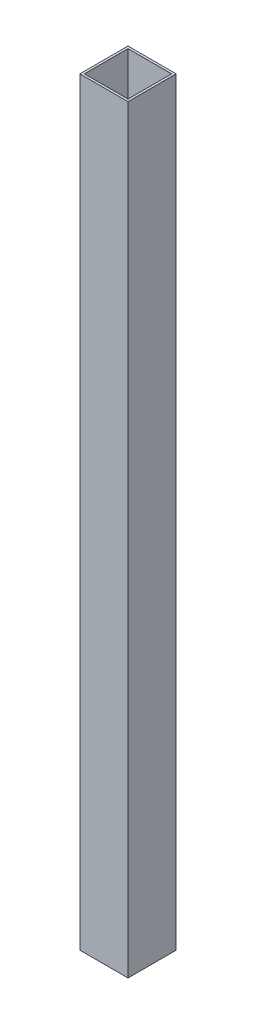
ISO-10303-21;
HEADER;
FILE_DESCRIPTION(('STEP AP214'),'2;1');
FILE_NAME('part.step','',(''),(''),'','','');
FILE_SCHEMA(('AUTOMOTIVE_DESIGN { 1 0 10303 214 1 1 1 1 }'));
ENDSEC;
DATA;
#1=APPLICATION_CONTEXT('core data for automotive mechanical design processes');
#2=APPLICATION_PROTOCOL_DEFINITION('international standard','automotive_design',2000,#1);
#3=PRODUCT_CONTEXT('',#1,'mechanical');
#4=PRODUCT('Part','Part','',(#3));
#5=PRODUCT_RELATED_PRODUCT_CATEGORY('part','',(#4));
#6=PRODUCT_DEFINITION_FORMATION('','',#4);
#7=PRODUCT_DEFINITION_CONTEXT('part definition',#1,'design');
#8=PRODUCT_DEFINITION('design','',#6,#7);
#9=PRODUCT_DEFINITION_SHAPE('','',#8);
#10=(LENGTH_UNIT() NAMED_UNIT(*) SI_UNIT(.MILLI.,.METRE.));
#11=(NAMED_UNIT(*) PLANE_ANGLE_UNIT() SI_UNIT($,.RADIAN.));
#12=(NAMED_UNIT(*) SI_UNIT($,.STERADIAN.) SOLID_ANGLE_UNIT());
#13=UNCERTAINTY_MEASURE_WITH_UNIT(LENGTH_MEASURE(1.E-05),#10,'distance_accuracy_value','');
#14=(GEOMETRIC_REPRESENTATION_CONTEXT(3) GLOBAL_UNCERTAINTY_ASSIGNED_CONTEXT((#13)) GLOBAL_UNIT_ASSIGNED_CONTEXT((#10,
#11,#12)) REPRESENTATION_CONTEXT('',''));
#15=CARTESIAN_POINT('',(0.,0.,0.));
#16=DIRECTION('',(0.,0.,1.));
#17=DIRECTION('',(1.,0.,0.));
#18=AXIS2_PLACEMENT_3D('',#15,#16,#17);
#19=CARTESIAN_POINT('',(0.,400.,0.));
#20=DIRECTION('',(0.,-1.,0.));
#21=DIRECTION('',(0.,0.,-1.));
#22=AXIS2_PLACEMENT_3D('',#19,#20,#21);
#23=PLANE('',#22);
#24=DIRECTION('',(0.,0.,-1.));
#25=VECTOR('',#24,1.);
#26=CARTESIAN_POINT('',(12.7,400.,12.7));
#27=LINE('',#26,#25);
#28=CARTESIAN_POINT('',(12.7,400.,12.7));
#29=VERTEX_POINT('',#28);
#30=CARTESIAN_POINT('',(12.7,400.,-12.7));
#31=VERTEX_POINT('',#30);
#32=EDGE_CURVE('E138',#29,#31,#27,.T.);
#33=ORIENTED_EDGE('',*,*,#32,.T.);
#34=DIRECTION('',(-1.,0.,0.));
#35=VECTOR('',#34,1.);
#36=CARTESIAN_POINT('',(-12.7,400.,-12.7));
#37=LINE('',#36,#35);
#38=CARTESIAN_POINT('',(-12.7,400.,-12.7));
#39=VERTEX_POINT('',#38);
#40=EDGE_CURVE('E141',#31,#39,#37,.T.);
#41=ORIENTED_EDGE('',*,*,#40,.T.);
#42=DIRECTION('',(0.,0.,1.));
#43=VECTOR('',#42,1.);
#44=CARTESIAN_POINT('',(-12.7,400.,12.7));
#45=LINE('',#44,#43);
#46=CARTESIAN_POINT('',(-12.7,400.,12.7));
#47=VERTEX_POINT('',#46);
#48=EDGE_CURVE('E144',#39,#47,#45,.T.);
#49=ORIENTED_EDGE('',*,*,#48,.T.);
#50=DIRECTION('',(1.,0.,0.));
#51=VECTOR('',#50,1.);
#52=CARTESIAN_POINT('',(-12.7,400.,12.7));
#53=LINE('',#52,#51);
#54=EDGE_CURVE('E146',#47,#29,#53,.T.);
#55=ORIENTED_EDGE('',*,*,#54,.T.);
#56=EDGE_LOOP('',(#33,#41,#49,#55));
#57=FACE_BOUND('',#56,.T.);
#58=DIRECTION('',(0.,0.,1.));
#59=VECTOR('',#58,1.);
#60=CARTESIAN_POINT('',(-11.5,400.,11.5));
#61=LINE('',#60,#59);
#62=CARTESIAN_POINT('',(-11.5,400.,-11.5));
#63=VERTEX_POINT('',#62);
#64=CARTESIAN_POINT('',(-11.5,400.,11.5));
#65=VERTEX_POINT('',#64);
#66=EDGE_CURVE('E102',#63,#65,#61,.T.);
#67=ORIENTED_EDGE('',*,*,#66,.F.);
#68=DIRECTION('',(-1.,0.,0.));
#69=VECTOR('',#68,1.);
#70=CARTESIAN_POINT('',(-11.5,400.,-11.5));
#71=LINE('',#70,#69);
#72=CARTESIAN_POINT('',(11.5,400.,-11.5));
#73=VERTEX_POINT('',#72);
#74=EDGE_CURVE('E124',#73,#63,#71,.T.);
#75=ORIENTED_EDGE('',*,*,#74,.F.);
#76=DIRECTION('',(0.,0.,-1.));
#77=VECTOR('',#76,1.);
#78=CARTESIAN_POINT('',(11.5,400.,11.5));
#79=LINE('',#78,#77);
#80=CARTESIAN_POINT('',(11.5,400.,11.5));
#81=VERTEX_POINT('',#80);
#82=EDGE_CURVE('E122',#81,#73,#79,.T.);
#83=ORIENTED_EDGE('',*,*,#82,.F.);
#84=DIRECTION('',(1.,0.,0.));
#85=VECTOR('',#84,1.);
#86=CARTESIAN_POINT('',(-11.5,400.,11.5));
#87=LINE('',#86,#85);
#88=EDGE_CURVE('E110',#65,#81,#87,.T.);
#89=ORIENTED_EDGE('',*,*,#88,.F.);
#90=EDGE_LOOP('',(#67,#75,#83,#89));
#91=FACE_BOUND('',#90,.T.);
#92=ADVANCED_FACE('F37',(#57,#91),#23,.F.);
#93=CARTESIAN_POINT('',(0.,0.,0.));
#94=DIRECTION('',(0.,-1.,0.));
#95=DIRECTION('',(0.,0.,-1.));
#96=AXIS2_PLACEMENT_3D('',#93,#94,#95);
#97=PLANE('',#96);
#98=DIRECTION('',(0.,0.,-1.));
#99=VECTOR('',#98,1.);
#100=CARTESIAN_POINT('',(12.7,0.,12.7));
#101=LINE('',#100,#99);
#102=CARTESIAN_POINT('',(12.7,0.,12.7));
#103=VERTEX_POINT('',#102);
#104=CARTESIAN_POINT('',(12.7,0.,-12.7));
#105=VERTEX_POINT('',#104);
#106=EDGE_CURVE('E118',#103,#105,#101,.T.);
#107=ORIENTED_EDGE('',*,*,#106,.F.);
#108=DIRECTION('',(1.,0.,0.));
#109=VECTOR('',#108,1.);
#110=CARTESIAN_POINT('',(-12.7,0.,12.7));
#111=LINE('',#110,#109);
#112=CARTESIAN_POINT('',(-12.7,0.,12.7));
#113=VERTEX_POINT('',#112);
#114=EDGE_CURVE('E142',#113,#103,#111,.T.);
#115=ORIENTED_EDGE('',*,*,#114,.F.);
#116=DIRECTION('',(0.,0.,1.));
#117=VECTOR('',#116,1.);
#118=CARTESIAN_POINT('',(-12.7,0.,12.7));
#119=LINE('',#118,#117);
#120=CARTESIAN_POINT('',(-12.7,0.,-12.7));
#121=VERTEX_POINT('',#120);
#122=EDGE_CURVE('E153',#121,#113,#119,.T.);
#123=ORIENTED_EDGE('',*,*,#122,.F.);
#124=DIRECTION('',(-1.,0.,0.));
#125=VECTOR('',#124,1.);
#126=CARTESIAN_POINT('',(-12.7,0.,-12.7));
#127=LINE('',#126,#125);
#128=EDGE_CURVE('E151',#105,#121,#127,.T.);
#129=ORIENTED_EDGE('',*,*,#128,.F.);
#130=EDGE_LOOP('',(#107,#115,#123,#129));
#131=FACE_BOUND('',#130,.T.);
#132=DIRECTION('',(-1.,0.,0.));
#133=VECTOR('',#132,1.);
#134=CARTESIAN_POINT('',(-11.5,0.,-11.5));
#135=LINE('',#134,#133);
#136=CARTESIAN_POINT('',(11.5,0.,-11.5));
#137=VERTEX_POINT('',#136);
#138=CARTESIAN_POINT('',(-11.5,0.,-11.5));
#139=VERTEX_POINT('',#138);
#140=EDGE_CURVE('E111',#137,#139,#135,.T.);
#141=ORIENTED_EDGE('',*,*,#140,.T.);
#142=DIRECTION('',(0.,0.,1.));
#143=VECTOR('',#142,1.);
#144=CARTESIAN_POINT('',(-11.5,0.,11.5));
#145=LINE('',#144,#143);
#146=CARTESIAN_POINT('',(-11.5,0.,11.5));
#147=VERTEX_POINT('',#146);
#148=EDGE_CURVE('E60',#139,#147,#145,.T.);
#149=ORIENTED_EDGE('',*,*,#148,.T.);
#150=DIRECTION('',(1.,0.,0.));
#151=VECTOR('',#150,1.);
#152=CARTESIAN_POINT('',(-11.5,0.,11.5));
#153=LINE('',#152,#151);
#154=CARTESIAN_POINT('',(11.5,0.,11.5));
#155=VERTEX_POINT('',#154);
#156=EDGE_CURVE('E117',#147,#155,#153,.T.);
#157=ORIENTED_EDGE('',*,*,#156,.T.);
#158=DIRECTION('',(0.,0.,-1.));
#159=VECTOR('',#158,1.);
#160=CARTESIAN_POINT('',(11.5,0.,11.5));
#161=LINE('',#160,#159);
#162=EDGE_CURVE('E130',#155,#137,#161,.T.);
#163=ORIENTED_EDGE('',*,*,#162,.T.);
#164=EDGE_LOOP('',(#141,#149,#157,#163));
#165=FACE_BOUND('',#164,.T.);
#166=ADVANCED_FACE('F171',(#131,#165),#97,.T.);
#167=CARTESIAN_POINT('',(12.7,400.,12.7));
#168=DIRECTION('',(-1.,0.,0.));
#169=DIRECTION('',(0.,0.,1.));
#170=AXIS2_PLACEMENT_3D('',#167,#168,#169);
#171=PLANE('',#170);
#172=ORIENTED_EDGE('',*,*,#106,.T.);
#173=DIRECTION('',(0.,-1.,0.));
#174=VECTOR('',#173,1.);
#175=CARTESIAN_POINT('',(12.7,400.,-12.7));
#176=LINE('',#175,#174);
#177=EDGE_CURVE('E11',#31,#105,#176,.T.);
#178=ORIENTED_EDGE('',*,*,#177,.F.);
#179=ORIENTED_EDGE('',*,*,#32,.F.);
#180=DIRECTION('',(0.,-1.,0.));
#181=VECTOR('',#180,1.);
#182=CARTESIAN_POINT('',(12.7,400.,12.7));
#183=LINE('',#182,#181);
#184=EDGE_CURVE('E148',#29,#103,#183,.T.);
#185=ORIENTED_EDGE('',*,*,#184,.T.);
#186=EDGE_LOOP('',(#172,#178,#179,#185));
#187=FACE_BOUND('',#186,.T.);
#188=ADVANCED_FACE('F39',(#187),#171,.F.);
#189=CARTESIAN_POINT('',(-12.7,400.,-12.7));
#190=DIRECTION('',(0.,0.,1.));
#191=DIRECTION('',(1.,0.,0.));
#192=AXIS2_PLACEMENT_3D('',#189,#190,#191);
#193=PLANE('',#192);
#194=ORIENTED_EDGE('',*,*,#128,.T.);
#195=DIRECTION('',(0.,-1.,0.));
#196=VECTOR('',#195,1.);
#197=CARTESIAN_POINT('',(-12.7,400.,-12.7));
#198=LINE('',#197,#196);
#199=EDGE_CURVE('E45',#39,#121,#198,.T.);
#200=ORIENTED_EDGE('',*,*,#199,.F.);
#201=ORIENTED_EDGE('',*,*,#40,.F.);
#202=ORIENTED_EDGE('',*,*,#177,.T.);
#203=EDGE_LOOP('',(#194,#200,#201,#202));
#204=FACE_BOUND('',#203,.T.);
#205=ADVANCED_FACE('F181',(#204),#193,.F.);
#206=CARTESIAN_POINT('',(-12.7,400.,12.7));
#207=DIRECTION('',(1.,0.,0.));
#208=DIRECTION('',(0.,0.,-1.));
#209=AXIS2_PLACEMENT_3D('',#206,#207,#208);
#210=PLANE('',#209);
#211=ORIENTED_EDGE('',*,*,#122,.T.);
#212=DIRECTION('',(0.,-1.,0.));
#213=VECTOR('',#212,1.);
#214=CARTESIAN_POINT('',(-12.7,400.,12.7));
#215=LINE('',#214,#213);
#216=EDGE_CURVE('E158',#47,#113,#215,.T.);
#217=ORIENTED_EDGE('',*,*,#216,.F.);
#218=ORIENTED_EDGE('',*,*,#48,.F.);
#219=ORIENTED_EDGE('',*,*,#199,.T.);
#220=EDGE_LOOP('',(#211,#217,#218,#219));
#221=FACE_BOUND('',#220,.T.);
#222=ADVANCED_FACE('F165',(#221),#210,.F.);
#223=CARTESIAN_POINT('',(-12.7,400.,12.7));
#224=DIRECTION('',(0.,0.,-1.));
#225=DIRECTION('',(-1.,0.,0.));
#226=AXIS2_PLACEMENT_3D('',#223,#224,#225);
#227=PLANE('',#226);
#228=ORIENTED_EDGE('',*,*,#114,.T.);
#229=ORIENTED_EDGE('',*,*,#184,.F.);
#230=ORIENTED_EDGE('',*,*,#54,.F.);
#231=ORIENTED_EDGE('',*,*,#216,.T.);
#232=EDGE_LOOP('',(#228,#229,#230,#231));
#233=FACE_BOUND('',#232,.T.);
#234=ADVANCED_FACE('F175',(#233),#227,.F.);
#235=CARTESIAN_POINT('',(-11.5,400.,11.5));
#236=DIRECTION('',(1.,0.,0.));
#237=DIRECTION('',(0.,0.,-1.));
#238=AXIS2_PLACEMENT_3D('',#235,#236,#237);
#239=PLANE('',#238);
#240=ORIENTED_EDGE('',*,*,#148,.F.);
#241=DIRECTION('',(0.,-1.,0.));
#242=VECTOR('',#241,1.);
#243=CARTESIAN_POINT('',(-11.5,400.,-11.5));
#244=LINE('',#243,#242);
#245=EDGE_CURVE('E106',#63,#139,#244,.T.);
#246=ORIENTED_EDGE('',*,*,#245,.F.);
#247=ORIENTED_EDGE('',*,*,#66,.T.);
#248=DIRECTION('',(0.,-1.,0.));
#249=VECTOR('',#248,1.);
#250=CARTESIAN_POINT('',(-11.5,400.,11.5));
#251=LINE('',#250,#249);
#252=EDGE_CURVE('E105',#65,#147,#251,.T.);
#253=ORIENTED_EDGE('',*,*,#252,.T.);
#254=EDGE_LOOP('',(#240,#246,#247,#253));
#255=FACE_BOUND('',#254,.T.);
#256=ADVANCED_FACE('F104',(#255),#239,.T.);
#257=CARTESIAN_POINT('',(-11.5,400.,11.5));
#258=DIRECTION('',(0.,0.,-1.));
#259=DIRECTION('',(-1.,0.,0.));
#260=AXIS2_PLACEMENT_3D('',#257,#258,#259);
#261=PLANE('',#260);
#262=ORIENTED_EDGE('',*,*,#156,.F.);
#263=ORIENTED_EDGE('',*,*,#252,.F.);
#264=ORIENTED_EDGE('',*,*,#88,.T.);
#265=DIRECTION('',(0.,-1.,0.));
#266=VECTOR('',#265,1.);
#267=CARTESIAN_POINT('',(11.5,400.,11.5));
#268=LINE('',#267,#266);
#269=EDGE_CURVE('E119',#81,#155,#268,.T.);
#270=ORIENTED_EDGE('',*,*,#269,.T.);
#271=EDGE_LOOP('',(#262,#263,#264,#270));
#272=FACE_BOUND('',#271,.T.);
#273=ADVANCED_FACE('F114',(#272),#261,.T.);
#274=CARTESIAN_POINT('',(11.5,400.,11.5));
#275=DIRECTION('',(-1.,0.,0.));
#276=DIRECTION('',(0.,0.,1.));
#277=AXIS2_PLACEMENT_3D('',#274,#275,#276);
#278=PLANE('',#277);
#279=ORIENTED_EDGE('',*,*,#162,.F.);
#280=ORIENTED_EDGE('',*,*,#269,.F.);
#281=ORIENTED_EDGE('',*,*,#82,.T.);
#282=DIRECTION('',(0.,-1.,0.));
#283=VECTOR('',#282,1.);
#284=CARTESIAN_POINT('',(11.5,400.,-11.5));
#285=LINE('',#284,#283);
#286=EDGE_CURVE('E52',#73,#137,#285,.T.);
#287=ORIENTED_EDGE('',*,*,#286,.T.);
#288=EDGE_LOOP('',(#279,#280,#281,#287));
#289=FACE_BOUND('',#288,.T.);
#290=ADVANCED_FACE('F204',(#289),#278,.T.);
#291=CARTESIAN_POINT('',(-11.5,400.,-11.5));
#292=DIRECTION('',(0.,0.,1.));
#293=DIRECTION('',(1.,0.,0.));
#294=AXIS2_PLACEMENT_3D('',#291,#292,#293);
#295=PLANE('',#294);
#296=ORIENTED_EDGE('',*,*,#140,.F.);
#297=ORIENTED_EDGE('',*,*,#286,.F.);
#298=ORIENTED_EDGE('',*,*,#74,.T.);
#299=ORIENTED_EDGE('',*,*,#245,.T.);
#300=EDGE_LOOP('',(#296,#297,#298,#299));
#301=FACE_BOUND('',#300,.T.);
#302=ADVANCED_FACE('F208',(#301),#295,.T.);
#303=CLOSED_SHELL('',(#92,#166,#188,#205,#222,#234,#256,#273,#290,#302));
#304=MANIFOLD_SOLID_BREP('B2',#303);
#305=ADVANCED_BREP_SHAPE_REPRESENTATION('',(#18,#304),#14);
#306=SHAPE_DEFINITION_REPRESENTATION(#9,#305);
ENDSEC;
END-ISO-10303-21;
